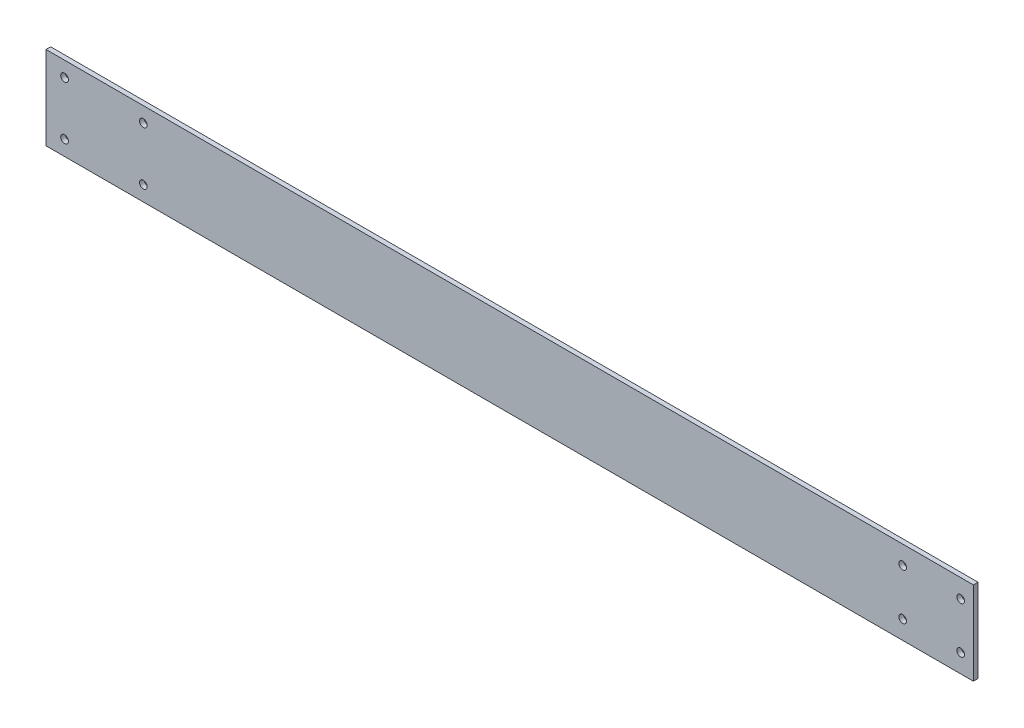
ISO-10303-21;
HEADER;
FILE_DESCRIPTION(('STEP AP214'),'2;1');
FILE_NAME('part.step','',(''),(''),'','','');
FILE_SCHEMA(('AUTOMOTIVE_DESIGN { 1 0 10303 214 1 1 1 1 }'));
ENDSEC;
DATA;
#1=APPLICATION_CONTEXT('core data for automotive mechanical design processes');
#2=APPLICATION_PROTOCOL_DEFINITION('international standard','automotive_design',2000,#1);
#3=PRODUCT_CONTEXT('',#1,'mechanical');
#4=PRODUCT('Part','Part','',(#3));
#5=PRODUCT_RELATED_PRODUCT_CATEGORY('part','',(#4));
#6=PRODUCT_DEFINITION_FORMATION('','',#4);
#7=PRODUCT_DEFINITION_CONTEXT('part definition',#1,'design');
#8=PRODUCT_DEFINITION('design','',#6,#7);
#9=PRODUCT_DEFINITION_SHAPE('','',#8);
#10=(LENGTH_UNIT() NAMED_UNIT(*) SI_UNIT(.MILLI.,.METRE.));
#11=(NAMED_UNIT(*) PLANE_ANGLE_UNIT() SI_UNIT($,.RADIAN.));
#12=(NAMED_UNIT(*) SI_UNIT($,.STERADIAN.) SOLID_ANGLE_UNIT());
#13=UNCERTAINTY_MEASURE_WITH_UNIT(LENGTH_MEASURE(1.E-05),#10,'distance_accuracy_value','');
#14=(GEOMETRIC_REPRESENTATION_CONTEXT(3) GLOBAL_UNCERTAINTY_ASSIGNED_CONTEXT((#13)) GLOBAL_UNIT_ASSIGNED_CONTEXT((#10,
#11,#12)) REPRESENTATION_CONTEXT('',''));
#15=CARTESIAN_POINT('',(0.,0.,0.));
#16=DIRECTION('',(0.,0.,1.));
#17=DIRECTION('',(1.,0.,0.));
#18=AXIS2_PLACEMENT_3D('',#15,#16,#17);
#19=CARTESIAN_POINT('',(400.,-28.342266003004,2.));
#20=DIRECTION('',(0.,-1.,0.));
#21=DIRECTION('',(1.,0.,0.));
#22=AXIS2_PLACEMENT_3D('',#19,#20,#21);
#23=PLANE('',#22);
#24=DIRECTION('',(-1.,0.,0.));
#25=VECTOR('',#24,1.);
#26=CARTESIAN_POINT('',(400.,-28.342266003004,0.));
#27=LINE('',#26,#25);
#28=CARTESIAN_POINT('',(400.,-28.342266003004,0.));
#29=VERTEX_POINT('',#28);
#30=CARTESIAN_POINT('',(0.,-28.342266003004,0.));
#31=VERTEX_POINT('',#30);
#32=EDGE_CURVE('E98',#29,#31,#27,.T.);
#33=ORIENTED_EDGE('',*,*,#32,.T.);
#34=DIRECTION('',(0.,0.,-1.));
#35=VECTOR('',#34,1.);
#36=CARTESIAN_POINT('',(0.,-28.342266003004,2.));
#37=LINE('',#36,#35);
#38=CARTESIAN_POINT('',(0.,-28.342266003004,2.));
#39=VERTEX_POINT('',#38);
#40=EDGE_CURVE('E11',#39,#31,#37,.T.);
#41=ORIENTED_EDGE('',*,*,#40,.F.);
#42=DIRECTION('',(-1.,0.,0.));
#43=VECTOR('',#42,1.);
#44=CARTESIAN_POINT('',(400.,-28.342266003004,2.));
#45=LINE('',#44,#43);
#46=CARTESIAN_POINT('',(400.,-28.342266003004,2.));
#47=VERTEX_POINT('',#46);
#48=EDGE_CURVE('E86',#47,#39,#45,.T.);
#49=ORIENTED_EDGE('',*,*,#48,.F.);
#50=DIRECTION('',(0.,0.,-1.));
#51=VECTOR('',#50,1.);
#52=CARTESIAN_POINT('',(400.,-28.342266003004,2.));
#53=LINE('',#52,#51);
#54=EDGE_CURVE('E94',#47,#29,#53,.T.);
#55=ORIENTED_EDGE('',*,*,#54,.T.);
#56=EDGE_LOOP('',(#33,#41,#49,#55));
#57=FACE_BOUND('',#56,.T.);
#58=ADVANCED_FACE('F35',(#57),#23,.F.);
#59=CARTESIAN_POINT('',(0.,-28.342266003004,2.));
#60=DIRECTION('',(1.,0.,0.));
#61=DIRECTION('',(0.,1.,0.));
#62=AXIS2_PLACEMENT_3D('',#59,#60,#61);
#63=PLANE('',#62);
#64=DIRECTION('',(0.,-1.,0.));
#65=VECTOR('',#64,1.);
#66=CARTESIAN_POINT('',(0.,-28.342266003004,0.));
#67=LINE('',#66,#65);
#68=CARTESIAN_POINT('',(0.,-64.342266003004,0.));
#69=VERTEX_POINT('',#68);
#70=EDGE_CURVE('E90',#31,#69,#67,.T.);
#71=ORIENTED_EDGE('',*,*,#70,.T.);
#72=DIRECTION('',(0.,0.,-1.));
#73=VECTOR('',#72,1.);
#74=CARTESIAN_POINT('',(0.,-64.342266003004,2.));
#75=LINE('',#74,#73);
#76=CARTESIAN_POINT('',(0.,-64.342266003004,2.));
#77=VERTEX_POINT('',#76);
#78=EDGE_CURVE('E43',#77,#69,#75,.T.);
#79=ORIENTED_EDGE('',*,*,#78,.F.);
#80=DIRECTION('',(0.,-1.,0.));
#81=VECTOR('',#80,1.);
#82=CARTESIAN_POINT('',(0.,-28.342266003004,2.));
#83=LINE('',#82,#81);
#84=EDGE_CURVE('E81',#39,#77,#83,.T.);
#85=ORIENTED_EDGE('',*,*,#84,.F.);
#86=ORIENTED_EDGE('',*,*,#40,.T.);
#87=EDGE_LOOP('',(#71,#79,#85,#86));
#88=FACE_BOUND('',#87,.T.);
#89=ADVANCED_FACE('F89',(#88),#63,.F.);
#90=CARTESIAN_POINT('',(0.,-64.342266003004,2.));
#91=DIRECTION('',(0.,1.,0.));
#92=DIRECTION('',(0.,0.,1.));
#93=AXIS2_PLACEMENT_3D('',#90,#91,#92);
#94=PLANE('',#93);
#95=DIRECTION('',(1.,0.,0.));
#96=VECTOR('',#95,1.);
#97=CARTESIAN_POINT('',(0.,-64.342266003004,0.));
#98=LINE('',#97,#96);
#99=CARTESIAN_POINT('',(400.,-64.342266003004,0.));
#100=VERTEX_POINT('',#99);
#101=EDGE_CURVE('E68',#69,#100,#98,.T.);
#102=ORIENTED_EDGE('',*,*,#101,.T.);
#103=DIRECTION('',(0.,0.,-1.));
#104=VECTOR('',#103,1.);
#105=CARTESIAN_POINT('',(400.,-64.342266003004,2.));
#106=LINE('',#105,#104);
#107=CARTESIAN_POINT('',(400.,-64.342266003004,2.));
#108=VERTEX_POINT('',#107);
#109=EDGE_CURVE('E91',#108,#100,#106,.T.);
#110=ORIENTED_EDGE('',*,*,#109,.F.);
#111=DIRECTION('',(1.,0.,0.));
#112=VECTOR('',#111,1.);
#113=CARTESIAN_POINT('',(0.,-64.342266003004,2.));
#114=LINE('',#113,#112);
#115=EDGE_CURVE('E84',#77,#108,#114,.T.);
#116=ORIENTED_EDGE('',*,*,#115,.F.);
#117=ORIENTED_EDGE('',*,*,#78,.T.);
#118=EDGE_LOOP('',(#102,#110,#116,#117));
#119=FACE_BOUND('',#118,.T.);
#120=ADVANCED_FACE('F92',(#119),#94,.F.);
#121=CARTESIAN_POINT('',(400.,-64.342266003004,2.));
#122=DIRECTION('',(-1.,0.,0.));
#123=DIRECTION('',(0.,0.,1.));
#124=AXIS2_PLACEMENT_3D('',#121,#122,#123);
#125=PLANE('',#124);
#126=DIRECTION('',(0.,1.,0.));
#127=VECTOR('',#126,1.);
#128=CARTESIAN_POINT('',(400.,-64.342266003004,0.));
#129=LINE('',#128,#127);
#130=EDGE_CURVE('E74',#100,#29,#129,.T.);
#131=ORIENTED_EDGE('',*,*,#130,.T.);
#132=ORIENTED_EDGE('',*,*,#54,.F.);
#133=DIRECTION('',(0.,1.,0.));
#134=VECTOR('',#133,1.);
#135=CARTESIAN_POINT('',(400.,-64.342266003004,2.));
#136=LINE('',#135,#134);
#137=EDGE_CURVE('E51',#108,#47,#136,.T.);
#138=ORIENTED_EDGE('',*,*,#137,.F.);
#139=ORIENTED_EDGE('',*,*,#109,.T.);
#140=EDGE_LOOP('',(#131,#132,#138,#139));
#141=FACE_BOUND('',#140,.T.);
#142=ADVANCED_FACE('F106',(#141),#125,.F.);
#143=CARTESIAN_POINT('',(0.,0.,2.));
#144=DIRECTION('',(0.,0.,1.));
#145=DIRECTION('',(1.,0.,0.));
#146=AXIS2_PLACEMENT_3D('',#143,#144,#145);
#147=PLANE('',#146);
#148=CARTESIAN_POINT('',(394.5,-36.342266003004,2.));
#149=DIRECTION('',(0.,0.,1.));
#150=DIRECTION('',(1.,0.,0.));
#151=AXIS2_PLACEMENT_3D('',#148,#149,#150);
#152=CIRCLE('',#151,1.64999999999998);
#153=CARTESIAN_POINT('',(396.15,-36.342266003004,2.));
#154=VERTEX_POINT('',#153);
#155=EDGE_CURVE('E156',#154,#154,#152,.T.);
#156=ORIENTED_EDGE('',*,*,#155,.F.);
#157=EDGE_LOOP('',(#156));
#158=FACE_BOUND('',#157,.T.);
#159=CARTESIAN_POINT('',(394.5,-56.342266003004,2.));
#160=DIRECTION('',(0.,0.,1.));
#161=DIRECTION('',(1.,0.,0.));
#162=AXIS2_PLACEMENT_3D('',#159,#160,#161);
#163=CIRCLE('',#162,1.64999999999998);
#164=CARTESIAN_POINT('',(396.15,-56.342266003004,2.));
#165=VERTEX_POINT('',#164);
#166=EDGE_CURVE('E150',#165,#165,#163,.T.);
#167=ORIENTED_EDGE('',*,*,#166,.F.);
#168=EDGE_LOOP('',(#167));
#169=FACE_BOUND('',#168,.T.);
#170=CARTESIAN_POINT('',(369.499999999994,-56.342266003004,2.));
#171=DIRECTION('',(0.,0.,1.));
#172=DIRECTION('',(1.,0.,0.));
#173=AXIS2_PLACEMENT_3D('',#170,#171,#172);
#174=CIRCLE('',#173,1.64999999999998);
#175=CARTESIAN_POINT('',(371.149999999994,-56.342266003004,2.));
#176=VERTEX_POINT('',#175);
#177=EDGE_CURVE('E144',#176,#176,#174,.T.);
#178=ORIENTED_EDGE('',*,*,#177,.F.);
#179=EDGE_LOOP('',(#178));
#180=FACE_BOUND('',#179,.T.);
#181=CARTESIAN_POINT('',(369.499999999994,-36.342266003004,2.));
#182=DIRECTION('',(0.,0.,1.));
#183=DIRECTION('',(1.,0.,0.));
#184=AXIS2_PLACEMENT_3D('',#181,#182,#183);
#185=CIRCLE('',#184,1.64999999999998);
#186=CARTESIAN_POINT('',(371.149999999994,-36.342266003004,2.));
#187=VERTEX_POINT('',#186);
#188=EDGE_CURVE('E138',#187,#187,#185,.T.);
#189=ORIENTED_EDGE('',*,*,#188,.F.);
#190=EDGE_LOOP('',(#189));
#191=FACE_BOUND('',#190,.T.);
#192=CARTESIAN_POINT('',(8.,-34.842266003004,2.));
#193=DIRECTION('',(0.,0.,1.));
#194=DIRECTION('',(1.,0.,0.));
#195=AXIS2_PLACEMENT_3D('',#192,#193,#194);
#196=CIRCLE('',#195,1.64999999999999);
#197=CARTESIAN_POINT('',(9.64999999999999,-34.842266003004,2.));
#198=VERTEX_POINT('',#197);
#199=EDGE_CURVE('E132',#198,#198,#196,.T.);
#200=ORIENTED_EDGE('',*,*,#199,.F.);
#201=EDGE_LOOP('',(#200));
#202=FACE_BOUND('',#201,.T.);
#203=CARTESIAN_POINT('',(42.,-34.842266003004,2.));
#204=DIRECTION('',(0.,0.,1.));
#205=DIRECTION('',(1.,0.,0.));
#206=AXIS2_PLACEMENT_3D('',#203,#204,#205);
#207=CIRCLE('',#206,1.64999999999999);
#208=CARTESIAN_POINT('',(43.65,-34.842266003004,2.));
#209=VERTEX_POINT('',#208);
#210=EDGE_CURVE('E126',#209,#209,#207,.T.);
#211=ORIENTED_EDGE('',*,*,#210,.F.);
#212=EDGE_LOOP('',(#211));
#213=FACE_BOUND('',#212,.T.);
#214=CARTESIAN_POINT('',(8.,-57.842266003004,2.));
#215=DIRECTION('',(0.,0.,1.));
#216=DIRECTION('',(1.,0.,0.));
#217=AXIS2_PLACEMENT_3D('',#214,#215,#216);
#218=CIRCLE('',#217,1.64999999999999);
#219=CARTESIAN_POINT('',(9.64999999999999,-57.842266003004,2.));
#220=VERTEX_POINT('',#219);
#221=EDGE_CURVE('E120',#220,#220,#218,.T.);
#222=ORIENTED_EDGE('',*,*,#221,.F.);
#223=EDGE_LOOP('',(#222));
#224=FACE_BOUND('',#223,.T.);
#225=CARTESIAN_POINT('',(42.,-57.842266003004,2.));
#226=DIRECTION('',(0.,0.,1.));
#227=DIRECTION('',(1.,0.,0.));
#228=AXIS2_PLACEMENT_3D('',#225,#226,#227);
#229=CIRCLE('',#228,1.64999999999999);
#230=CARTESIAN_POINT('',(43.65,-57.842266003004,2.));
#231=VERTEX_POINT('',#230);
#232=EDGE_CURVE('E114',#231,#231,#229,.T.);
#233=ORIENTED_EDGE('',*,*,#232,.F.);
#234=EDGE_LOOP('',(#233));
#235=FACE_BOUND('',#234,.T.);
#236=ORIENTED_EDGE('',*,*,#48,.T.);
#237=ORIENTED_EDGE('',*,*,#84,.T.);
#238=ORIENTED_EDGE('',*,*,#115,.T.);
#239=ORIENTED_EDGE('',*,*,#137,.T.);
#240=EDGE_LOOP('',(#236,#237,#238,#239));
#241=FACE_BOUND('',#240,.T.);
#242=ADVANCED_FACE('F82',(#158,#169,#180,#191,#202,#213,#224,#235,#241),#147,.T.);
#243=CARTESIAN_POINT('',(0.,0.,0.));
#244=DIRECTION('',(0.,0.,1.));
#245=DIRECTION('',(1.,0.,0.));
#246=AXIS2_PLACEMENT_3D('',#243,#244,#245);
#247=PLANE('',#246);
#248=CARTESIAN_POINT('',(394.5,-36.342266003004,0.));
#249=DIRECTION('',(0.,0.,1.));
#250=DIRECTION('',(1.,0.,0.));
#251=AXIS2_PLACEMENT_3D('',#248,#249,#250);
#252=CIRCLE('',#251,1.64999999999998);
#253=CARTESIAN_POINT('',(396.15,-36.342266003004,0.));
#254=VERTEX_POINT('',#253);
#255=EDGE_CURVE('E153',#254,#254,#252,.T.);
#256=ORIENTED_EDGE('',*,*,#255,.T.);
#257=EDGE_LOOP('',(#256));
#258=FACE_BOUND('',#257,.T.);
#259=CARTESIAN_POINT('',(394.5,-56.342266003004,0.));
#260=DIRECTION('',(0.,0.,1.));
#261=DIRECTION('',(1.,0.,0.));
#262=AXIS2_PLACEMENT_3D('',#259,#260,#261);
#263=CIRCLE('',#262,1.64999999999998);
#264=CARTESIAN_POINT('',(396.15,-56.342266003004,0.));
#265=VERTEX_POINT('',#264);
#266=EDGE_CURVE('E147',#265,#265,#263,.T.);
#267=ORIENTED_EDGE('',*,*,#266,.T.);
#268=EDGE_LOOP('',(#267));
#269=FACE_BOUND('',#268,.T.);
#270=CARTESIAN_POINT('',(369.499999999994,-56.342266003004,0.));
#271=DIRECTION('',(0.,0.,1.));
#272=DIRECTION('',(1.,0.,0.));
#273=AXIS2_PLACEMENT_3D('',#270,#271,#272);
#274=CIRCLE('',#273,1.64999999999998);
#275=CARTESIAN_POINT('',(371.149999999994,-56.342266003004,0.));
#276=VERTEX_POINT('',#275);
#277=EDGE_CURVE('E141',#276,#276,#274,.T.);
#278=ORIENTED_EDGE('',*,*,#277,.T.);
#279=EDGE_LOOP('',(#278));
#280=FACE_BOUND('',#279,.T.);
#281=CARTESIAN_POINT('',(369.499999999994,-36.342266003004,0.));
#282=DIRECTION('',(0.,0.,1.));
#283=DIRECTION('',(1.,0.,0.));
#284=AXIS2_PLACEMENT_3D('',#281,#282,#283);
#285=CIRCLE('',#284,1.64999999999998);
#286=CARTESIAN_POINT('',(371.149999999994,-36.342266003004,0.));
#287=VERTEX_POINT('',#286);
#288=EDGE_CURVE('E135',#287,#287,#285,.T.);
#289=ORIENTED_EDGE('',*,*,#288,.T.);
#290=EDGE_LOOP('',(#289));
#291=FACE_BOUND('',#290,.T.);
#292=CARTESIAN_POINT('',(8.,-34.842266003004,0.));
#293=DIRECTION('',(0.,0.,1.));
#294=DIRECTION('',(1.,0.,0.));
#295=AXIS2_PLACEMENT_3D('',#292,#293,#294);
#296=CIRCLE('',#295,1.64999999999999);
#297=CARTESIAN_POINT('',(9.64999999999999,-34.842266003004,0.));
#298=VERTEX_POINT('',#297);
#299=EDGE_CURVE('E129',#298,#298,#296,.T.);
#300=ORIENTED_EDGE('',*,*,#299,.T.);
#301=EDGE_LOOP('',(#300));
#302=FACE_BOUND('',#301,.T.);
#303=CARTESIAN_POINT('',(42.,-34.842266003004,0.));
#304=DIRECTION('',(0.,0.,1.));
#305=DIRECTION('',(1.,0.,0.));
#306=AXIS2_PLACEMENT_3D('',#303,#304,#305);
#307=CIRCLE('',#306,1.64999999999999);
#308=CARTESIAN_POINT('',(43.65,-34.842266003004,0.));
#309=VERTEX_POINT('',#308);
#310=EDGE_CURVE('E123',#309,#309,#307,.T.);
#311=ORIENTED_EDGE('',*,*,#310,.T.);
#312=EDGE_LOOP('',(#311));
#313=FACE_BOUND('',#312,.T.);
#314=CARTESIAN_POINT('',(8.,-57.842266003004,0.));
#315=DIRECTION('',(0.,0.,1.));
#316=DIRECTION('',(1.,0.,0.));
#317=AXIS2_PLACEMENT_3D('',#314,#315,#316);
#318=CIRCLE('',#317,1.64999999999999);
#319=CARTESIAN_POINT('',(9.64999999999999,-57.842266003004,0.));
#320=VERTEX_POINT('',#319);
#321=EDGE_CURVE('E117',#320,#320,#318,.T.);
#322=ORIENTED_EDGE('',*,*,#321,.T.);
#323=EDGE_LOOP('',(#322));
#324=FACE_BOUND('',#323,.T.);
#325=CARTESIAN_POINT('',(42.,-57.842266003004,0.));
#326=DIRECTION('',(0.,0.,1.));
#327=DIRECTION('',(1.,0.,0.));
#328=AXIS2_PLACEMENT_3D('',#325,#326,#327);
#329=CIRCLE('',#328,1.64999999999999);
#330=CARTESIAN_POINT('',(43.65,-57.842266003004,0.));
#331=VERTEX_POINT('',#330);
#332=EDGE_CURVE('E101',#331,#331,#329,.T.);
#333=ORIENTED_EDGE('',*,*,#332,.T.);
#334=EDGE_LOOP('',(#333));
#335=FACE_BOUND('',#334,.T.);
#336=ORIENTED_EDGE('',*,*,#32,.F.);
#337=ORIENTED_EDGE('',*,*,#130,.F.);
#338=ORIENTED_EDGE('',*,*,#101,.F.);
#339=ORIENTED_EDGE('',*,*,#70,.F.);
#340=EDGE_LOOP('',(#336,#337,#338,#339));
#341=FACE_BOUND('',#340,.T.);
#342=ADVANCED_FACE('F109',(#258,#269,#280,#291,#302,#313,#324,#335,#341),#247,.F.);
#343=CARTESIAN_POINT('',(42.,-57.842266003004,2.));
#344=DIRECTION('',(0.,0.,1.));
#345=DIRECTION('',(1.,0.,0.));
#346=AXIS2_PLACEMENT_3D('',#343,#344,#345);
#347=CYLINDRICAL_SURFACE('',#346,1.64999999999999);
#348=ORIENTED_EDGE('',*,*,#232,.T.);
#349=EDGE_LOOP('',(#348));
#350=FACE_BOUND('',#349,.T.);
#351=ORIENTED_EDGE('',*,*,#332,.F.);
#352=EDGE_LOOP('',(#351));
#353=FACE_BOUND('',#352,.T.);
#354=ADVANCED_FACE('F180',(#350,#353),#347,.F.);
#355=CARTESIAN_POINT('',(8.,-57.842266003004,2.));
#356=DIRECTION('',(0.,0.,1.));
#357=DIRECTION('',(1.,0.,0.));
#358=AXIS2_PLACEMENT_3D('',#355,#356,#357);
#359=CYLINDRICAL_SURFACE('',#358,1.64999999999999);
#360=ORIENTED_EDGE('',*,*,#221,.T.);
#361=EDGE_LOOP('',(#360));
#362=FACE_BOUND('',#361,.T.);
#363=ORIENTED_EDGE('',*,*,#321,.F.);
#364=EDGE_LOOP('',(#363));
#365=FACE_BOUND('',#364,.T.);
#366=ADVANCED_FACE('F183',(#362,#365),#359,.F.);
#367=CARTESIAN_POINT('',(42.,-34.842266003004,2.));
#368=DIRECTION('',(0.,0.,1.));
#369=DIRECTION('',(1.,0.,0.));
#370=AXIS2_PLACEMENT_3D('',#367,#368,#369);
#371=CYLINDRICAL_SURFACE('',#370,1.64999999999999);
#372=ORIENTED_EDGE('',*,*,#210,.T.);
#373=EDGE_LOOP('',(#372));
#374=FACE_BOUND('',#373,.T.);
#375=ORIENTED_EDGE('',*,*,#310,.F.);
#376=EDGE_LOOP('',(#375));
#377=FACE_BOUND('',#376,.T.);
#378=ADVANCED_FACE('F229',(#374,#377),#371,.F.);
#379=CARTESIAN_POINT('',(8.,-34.842266003004,2.));
#380=DIRECTION('',(0.,0.,1.));
#381=DIRECTION('',(1.,0.,0.));
#382=AXIS2_PLACEMENT_3D('',#379,#380,#381);
#383=CYLINDRICAL_SURFACE('',#382,1.64999999999999);
#384=ORIENTED_EDGE('',*,*,#199,.T.);
#385=EDGE_LOOP('',(#384));
#386=FACE_BOUND('',#385,.T.);
#387=ORIENTED_EDGE('',*,*,#299,.F.);
#388=EDGE_LOOP('',(#387));
#389=FACE_BOUND('',#388,.T.);
#390=ADVANCED_FACE('F237',(#386,#389),#383,.F.);
#391=CARTESIAN_POINT('',(369.499999999994,-36.342266003004,2.));
#392=DIRECTION('',(0.,0.,1.));
#393=DIRECTION('',(1.,0.,0.));
#394=AXIS2_PLACEMENT_3D('',#391,#392,#393);
#395=CYLINDRICAL_SURFACE('',#394,1.64999999999998);
#396=ORIENTED_EDGE('',*,*,#188,.T.);
#397=EDGE_LOOP('',(#396));
#398=FACE_BOUND('',#397,.T.);
#399=ORIENTED_EDGE('',*,*,#288,.F.);
#400=EDGE_LOOP('',(#399));
#401=FACE_BOUND('',#400,.T.);
#402=ADVANCED_FACE('F244',(#398,#401),#395,.F.);
#403=CARTESIAN_POINT('',(369.499999999994,-56.342266003004,2.));
#404=DIRECTION('',(0.,0.,1.));
#405=DIRECTION('',(1.,0.,0.));
#406=AXIS2_PLACEMENT_3D('',#403,#404,#405);
#407=CYLINDRICAL_SURFACE('',#406,1.64999999999998);
#408=ORIENTED_EDGE('',*,*,#177,.T.);
#409=EDGE_LOOP('',(#408));
#410=FACE_BOUND('',#409,.T.);
#411=ORIENTED_EDGE('',*,*,#277,.F.);
#412=EDGE_LOOP('',(#411));
#413=FACE_BOUND('',#412,.T.);
#414=ADVANCED_FACE('F251',(#410,#413),#407,.F.);
#415=CARTESIAN_POINT('',(394.5,-56.342266003004,2.));
#416=DIRECTION('',(0.,0.,1.));
#417=DIRECTION('',(1.,0.,0.));
#418=AXIS2_PLACEMENT_3D('',#415,#416,#417);
#419=CYLINDRICAL_SURFACE('',#418,1.64999999999998);
#420=ORIENTED_EDGE('',*,*,#166,.T.);
#421=EDGE_LOOP('',(#420));
#422=FACE_BOUND('',#421,.T.);
#423=ORIENTED_EDGE('',*,*,#266,.F.);
#424=EDGE_LOOP('',(#423));
#425=FACE_BOUND('',#424,.T.);
#426=ADVANCED_FACE('F259',(#422,#425),#419,.F.);
#427=CARTESIAN_POINT('',(394.5,-36.342266003004,2.));
#428=DIRECTION('',(0.,0.,1.));
#429=DIRECTION('',(1.,0.,0.));
#430=AXIS2_PLACEMENT_3D('',#427,#428,#429);
#431=CYLINDRICAL_SURFACE('',#430,1.64999999999998);
#432=ORIENTED_EDGE('',*,*,#155,.T.);
#433=EDGE_LOOP('',(#432));
#434=FACE_BOUND('',#433,.T.);
#435=ORIENTED_EDGE('',*,*,#255,.F.);
#436=EDGE_LOOP('',(#435));
#437=FACE_BOUND('',#436,.T.);
#438=ADVANCED_FACE('F160',(#434,#437),#431,.F.);
#439=CLOSED_SHELL('',(#58,#89,#120,#142,#242,#342,#354,#366,#378,#390,#402,#414,#426,#438));
#440=MANIFOLD_SOLID_BREP('B2',#439);
#441=ADVANCED_BREP_SHAPE_REPRESENTATION('',(#18,#440),#14);
#442=SHAPE_DEFINITION_REPRESENTATION(#9,#441);
ENDSEC;
END-ISO-10303-21;
